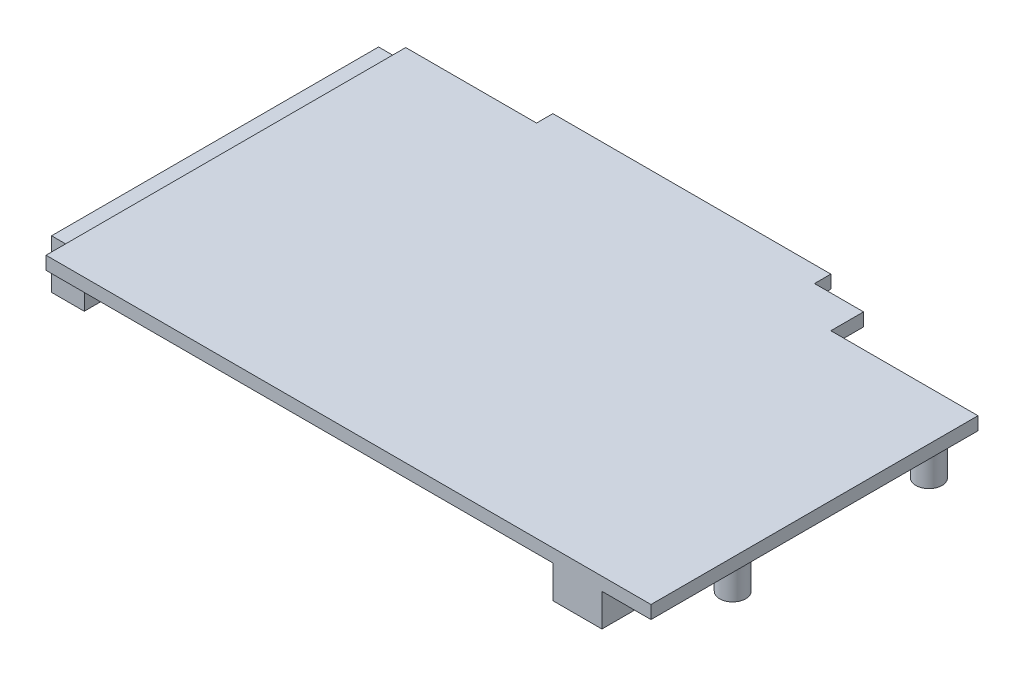
ISO-10303-21;
HEADER;
FILE_DESCRIPTION(('STEP AP214'),'2;1');
FILE_NAME('part.step','',(''),(''),'','','');
FILE_SCHEMA(('AUTOMOTIVE_DESIGN { 1 0 10303 214 1 1 1 1 }'));
ENDSEC;
DATA;
#1=APPLICATION_CONTEXT('core data for automotive mechanical design processes');
#2=APPLICATION_PROTOCOL_DEFINITION('international standard','automotive_design',2000,#1);
#3=PRODUCT_CONTEXT('',#1,'mechanical');
#4=PRODUCT('Part','Part','',(#3));
#5=PRODUCT_RELATED_PRODUCT_CATEGORY('part','',(#4));
#6=PRODUCT_DEFINITION_FORMATION('','',#4);
#7=PRODUCT_DEFINITION_CONTEXT('part definition',#1,'design');
#8=PRODUCT_DEFINITION('design','',#6,#7);
#9=PRODUCT_DEFINITION_SHAPE('','',#8);
#10=(LENGTH_UNIT() NAMED_UNIT(*) SI_UNIT(.MILLI.,.METRE.));
#11=(NAMED_UNIT(*) PLANE_ANGLE_UNIT() SI_UNIT($,.RADIAN.));
#12=(NAMED_UNIT(*) SI_UNIT($,.STERADIAN.) SOLID_ANGLE_UNIT());
#13=UNCERTAINTY_MEASURE_WITH_UNIT(LENGTH_MEASURE(1.E-05),#10,'distance_accuracy_value','');
#14=(GEOMETRIC_REPRESENTATION_CONTEXT(3) GLOBAL_UNCERTAINTY_ASSIGNED_CONTEXT((#13)) GLOBAL_UNIT_ASSIGNED_CONTEXT((#10,
#11,#12)) REPRESENTATION_CONTEXT('',''));
#15=CARTESIAN_POINT('',(0.,0.,0.));
#16=DIRECTION('',(0.,0.,1.));
#17=DIRECTION('',(1.,0.,0.));
#18=AXIS2_PLACEMENT_3D('',#15,#16,#17);
#19=CARTESIAN_POINT('',(0.,0.,-100.));
#20=DIRECTION('',(0.,-1.,0.));
#21=DIRECTION('',(0.,0.,-1.));
#22=AXIS2_PLACEMENT_3D('',#19,#20,#21);
#23=PLANE('',#22);
#24=CARTESIAN_POINT('',(180.,0.,-30.));
#25=DIRECTION('',(0.,-1.,0.));
#26=DIRECTION('',(0.,0.,-1.));
#27=AXIS2_PLACEMENT_3D('',#24,#25,#26);
#28=CIRCLE('',#27,3.99999999999999);
#29=CARTESIAN_POINT('',(180.,0.,-34.));
#30=VERTEX_POINT('',#29);
#31=EDGE_CURVE('E432',#30,#30,#28,.T.);
#32=ORIENTED_EDGE('',*,*,#31,.F.);
#33=EDGE_LOOP('',(#32));
#34=FACE_BOUND('',#33,.T.);
#35=DIRECTION('',(1.,0.,0.));
#36=VECTOR('',#35,1.);
#37=CARTESIAN_POINT('',(127.629312938026,0.,-90.));
#38=LINE('',#37,#36);
#39=CARTESIAN_POINT('',(127.629312938026,0.,-90.));
#40=VERTEX_POINT('',#39);
#41=CARTESIAN_POINT('',(147.629312938026,0.,-90.));
#42=VERTEX_POINT('',#41);
#43=EDGE_CURVE('E211',#40,#42,#38,.T.);
#44=ORIENTED_EDGE('',*,*,#43,.F.);
#45=DIRECTION('',(0.,0.,-1.));
#46=VECTOR('',#45,1.);
#47=CARTESIAN_POINT('',(127.629312938026,0.,-20.));
#48=LINE('',#47,#46);
#49=CARTESIAN_POINT('',(127.629312938026,0.,-20.));
#50=VERTEX_POINT('',#49);
#51=EDGE_CURVE('E208',#50,#40,#48,.T.);
#52=ORIENTED_EDGE('',*,*,#51,.F.);
#53=DIRECTION('',(-1.,0.,0.));
#54=VECTOR('',#53,1.);
#55=CARTESIAN_POINT('',(127.629312938026,0.,-20.));
#56=LINE('',#55,#54);
#57=CARTESIAN_POINT('',(147.629312938026,0.,-20.));
#58=VERTEX_POINT('',#57);
#59=EDGE_CURVE('E221',#58,#50,#56,.T.);
#60=ORIENTED_EDGE('',*,*,#59,.F.);
#61=DIRECTION('',(0.,0.,1.));
#62=VECTOR('',#61,1.);
#63=CARTESIAN_POINT('',(147.629312938026,0.,-20.));
#64=LINE('',#63,#62);
#65=EDGE_CURVE('E229',#42,#58,#64,.T.);
#66=ORIENTED_EDGE('',*,*,#65,.F.);
#67=EDGE_LOOP('',(#44,#52,#60,#66));
#68=FACE_BOUND('',#67,.T.);
#69=DIRECTION('',(1.,0.,0.));
#70=VECTOR('',#69,1.);
#71=CARTESIAN_POINT('',(0.,0.,0.));
#72=LINE('',#71,#70);
#73=CARTESIAN_POINT('',(170.,0.,0.));
#74=VERTEX_POINT('',#73);
#75=CARTESIAN_POINT('',(185.,0.,0.));
#76=VERTEX_POINT('',#75);
#77=EDGE_CURVE('E299',#74,#76,#72,.T.);
#78=ORIENTED_EDGE('',*,*,#77,.F.);
#79=DIRECTION('',(0.,0.,1.));
#80=VECTOR('',#79,1.);
#81=CARTESIAN_POINT('',(170.,0.,0.));
#82=LINE('',#81,#80);
#83=CARTESIAN_POINT('',(170.,0.,-20.));
#84=VERTEX_POINT('',#83);
#85=EDGE_CURVE('E49',#84,#74,#82,.T.);
#86=ORIENTED_EDGE('',*,*,#85,.F.);
#87=DIRECTION('',(1.,0.,0.));
#88=VECTOR('',#87,1.);
#89=CARTESIAN_POINT('',(170.,0.,-20.));
#90=LINE('',#89,#88);
#91=CARTESIAN_POINT('',(155.,0.,-20.));
#92=VERTEX_POINT('',#91);
#93=EDGE_CURVE('E205',#92,#84,#90,.T.);
#94=ORIENTED_EDGE('',*,*,#93,.F.);
#95=DIRECTION('',(0.,0.,-1.));
#96=VECTOR('',#95,1.);
#97=CARTESIAN_POINT('',(155.,0.,0.));
#98=LINE('',#97,#96);
#99=CARTESIAN_POINT('',(155.,0.,0.));
#100=VERTEX_POINT('',#99);
#101=EDGE_CURVE('E427',#100,#92,#98,.T.);
#102=ORIENTED_EDGE('',*,*,#101,.F.);
#103=CARTESIAN_POINT('',(0.,0.,0.));
#104=VERTEX_POINT('',#103);
#105=EDGE_CURVE('E307',#104,#100,#72,.T.);
#106=ORIENTED_EDGE('',*,*,#105,.F.);
#107=DIRECTION('',(0.,0.,1.));
#108=VECTOR('',#107,1.);
#109=CARTESIAN_POINT('',(0.,0.,0.));
#110=LINE('',#109,#108);
#111=CARTESIAN_POINT('',(0.,0.,-10.));
#112=VERTEX_POINT('',#111);
#113=EDGE_CURVE('E300',#112,#104,#110,.T.);
#114=ORIENTED_EDGE('',*,*,#113,.F.);
#115=DIRECTION('',(-1.,0.,0.));
#116=VECTOR('',#115,1.);
#117=CARTESIAN_POINT('',(1.69927822453019,0.,-10.));
#118=LINE('',#117,#116);
#119=CARTESIAN_POINT('',(1.69927822453019,0.,-10.));
#120=VERTEX_POINT('',#119);
#121=EDGE_CURVE('E252',#120,#112,#118,.T.);
#122=ORIENTED_EDGE('',*,*,#121,.F.);
#123=DIRECTION('',(0.,0.,1.));
#124=VECTOR('',#123,1.);
#125=CARTESIAN_POINT('',(1.69927822453019,0.,-110.));
#126=LINE('',#125,#124);
#127=CARTESIAN_POINT('',(1.69927822453018,0.,-110.));
#128=VERTEX_POINT('',#127);
#129=EDGE_CURVE('E240',#128,#120,#126,.T.);
#130=ORIENTED_EDGE('',*,*,#129,.F.);
#131=DIRECTION('',(1.,0.,0.));
#132=VECTOR('',#131,1.);
#133=CARTESIAN_POINT('',(-81.1570413077142,0.,-110.));
#134=LINE('',#133,#132);
#135=CARTESIAN_POINT('',(40.,0.,-110.));
#136=VERTEX_POINT('',#135);
#137=EDGE_CURVE('E278',#128,#136,#134,.T.);
#138=ORIENTED_EDGE('',*,*,#137,.T.);
#139=DIRECTION('',(0.,0.,-1.));
#140=VECTOR('',#139,1.);
#141=CARTESIAN_POINT('',(40.,0.,-53.5029668986773));
#142=LINE('',#141,#140);
#143=CARTESIAN_POINT('',(40.,0.,-115.));
#144=VERTEX_POINT('',#143);
#145=EDGE_CURVE('E276',#136,#144,#142,.T.);
#146=ORIENTED_EDGE('',*,*,#145,.T.);
#147=DIRECTION('',(1.,0.,0.));
#148=VECTOR('',#147,1.);
#149=CARTESIAN_POINT('',(-81.1570413077142,0.,-115.));
#150=LINE('',#149,#148);
#151=CARTESIAN_POINT('',(125.,0.,-115.));
#152=VERTEX_POINT('',#151);
#153=EDGE_CURVE('E274',#144,#152,#150,.T.);
#154=ORIENTED_EDGE('',*,*,#153,.T.);
#155=DIRECTION('',(0.,0.,-1.));
#156=VECTOR('',#155,1.);
#157=CARTESIAN_POINT('',(125.,0.,-53.5029668986773));
#158=LINE('',#157,#156);
#159=CARTESIAN_POINT('',(125.,0.,-110.));
#160=VERTEX_POINT('',#159);
#161=EDGE_CURVE('E270',#160,#152,#158,.T.);
#162=ORIENTED_EDGE('',*,*,#161,.F.);
#163=DIRECTION('',(-1.,0.,0.));
#164=VECTOR('',#163,1.);
#165=CARTESIAN_POINT('',(-81.1570413077142,0.,-110.));
#166=LINE('',#165,#164);
#167=CARTESIAN_POINT('',(140.,0.,-110.));
#168=VERTEX_POINT('',#167);
#169=EDGE_CURVE('E267',#168,#160,#166,.T.);
#170=ORIENTED_EDGE('',*,*,#169,.F.);
#171=DIRECTION('',(0.,0.,-1.));
#172=VECTOR('',#171,1.);
#173=CARTESIAN_POINT('',(140.,0.,-53.5029668986773));
#174=LINE('',#173,#172);
#175=CARTESIAN_POINT('',(140.,0.,-100.));
#176=VERTEX_POINT('',#175);
#177=EDGE_CURVE('E271',#176,#168,#174,.T.);
#178=ORIENTED_EDGE('',*,*,#177,.F.);
#179=DIRECTION('',(-1.,0.,0.));
#180=VECTOR('',#179,1.);
#181=CARTESIAN_POINT('',(0.,0.,-100.));
#182=LINE('',#181,#180);
#183=CARTESIAN_POINT('',(185.,0.,-100.));
#184=VERTEX_POINT('',#183);
#185=EDGE_CURVE('E311',#184,#176,#182,.T.);
#186=ORIENTED_EDGE('',*,*,#185,.F.);
#187=DIRECTION('',(0.,0.,-1.));
#188=VECTOR('',#187,1.);
#189=CARTESIAN_POINT('',(185.,0.,0.));
#190=LINE('',#189,#188);
#191=EDGE_CURVE('E309',#76,#184,#190,.T.);
#192=ORIENTED_EDGE('',*,*,#191,.F.);
#193=EDGE_LOOP('',(#78,#86,#94,#102,#106,#114,#122,#130,#138,#146,#154,#162,#170,#178,#186,#192));
#194=FACE_BOUND('',#193,.T.);
#195=CARTESIAN_POINT('',(180.,0.,-90.));
#196=DIRECTION('',(0.,-1.,0.));
#197=DIRECTION('',(0.,0.,-1.));
#198=AXIS2_PLACEMENT_3D('',#195,#196,#197);
#199=CIRCLE('',#198,3.99999999999999);
#200=CARTESIAN_POINT('',(180.,0.,-94.));
#201=VERTEX_POINT('',#200);
#202=EDGE_CURVE('E449',#201,#201,#199,.T.);
#203=ORIENTED_EDGE('',*,*,#202,.F.);
#204=EDGE_LOOP('',(#203));
#205=FACE_BOUND('',#204,.T.);
#206=ADVANCED_FACE('F32',(#34,#68,#194,#205),#23,.T.);
#207=CARTESIAN_POINT('',(0.,4.,0.));
#208=DIRECTION('',(1.,0.,0.));
#209=DIRECTION('',(0.,0.,-1.));
#210=AXIS2_PLACEMENT_3D('',#207,#208,#209);
#211=PLANE('',#210);
#212=CARTESIAN_POINT('',(0.,0.,-110.));
#213=VERTEX_POINT('',#212);
#214=EDGE_CURVE('E297',#213,#112,#110,.T.);
#215=ORIENTED_EDGE('',*,*,#214,.T.);
#216=ORIENTED_EDGE('',*,*,#113,.T.);
#217=DIRECTION('',(0.,-1.,0.));
#218=VECTOR('',#217,1.);
#219=CARTESIAN_POINT('',(0.,4.,0.));
#220=LINE('',#219,#218);
#221=CARTESIAN_POINT('',(0.,4.,0.));
#222=VERTEX_POINT('',#221);
#223=EDGE_CURVE('E11',#222,#104,#220,.T.);
#224=ORIENTED_EDGE('',*,*,#223,.F.);
#225=DIRECTION('',(0.,0.,1.));
#226=VECTOR('',#225,1.);
#227=CARTESIAN_POINT('',(0.,4.,0.));
#228=LINE('',#227,#226);
#229=CARTESIAN_POINT('',(0.,4.,-110.));
#230=VERTEX_POINT('',#229);
#231=EDGE_CURVE('E319',#230,#222,#228,.T.);
#232=ORIENTED_EDGE('',*,*,#231,.F.);
#233=DIRECTION('',(0.,1.,0.));
#234=VECTOR('',#233,1.);
#235=CARTESIAN_POINT('',(0.,0.,-110.));
#236=LINE('',#235,#234);
#237=EDGE_CURVE('E301',#213,#230,#236,.T.);
#238=ORIENTED_EDGE('',*,*,#237,.F.);
#239=EDGE_LOOP('',(#215,#216,#224,#232,#238));
#240=FACE_BOUND('',#239,.T.);
#241=ADVANCED_FACE('F34',(#240),#211,.F.);
#242=CARTESIAN_POINT('',(0.,4.,0.));
#243=DIRECTION('',(0.,0.,-1.));
#244=DIRECTION('',(-1.,0.,0.));
#245=AXIS2_PLACEMENT_3D('',#242,#243,#244);
#246=PLANE('',#245);
#247=ORIENTED_EDGE('',*,*,#105,.T.);
#248=DIRECTION('',(0.,1.,0.));
#249=VECTOR('',#248,1.);
#250=CARTESIAN_POINT('',(155.,-10.,0.));
#251=LINE('',#250,#249);
#252=CARTESIAN_POINT('',(155.,-10.,0.));
#253=VERTEX_POINT('',#252);
#254=EDGE_CURVE('E194',#253,#100,#251,.T.);
#255=ORIENTED_EDGE('',*,*,#254,.F.);
#256=DIRECTION('',(-1.,0.,0.));
#257=VECTOR('',#256,1.);
#258=CARTESIAN_POINT('',(170.,-10.,0.));
#259=LINE('',#258,#257);
#260=CARTESIAN_POINT('',(170.,-10.,0.));
#261=VERTEX_POINT('',#260);
#262=EDGE_CURVE('E188',#261,#253,#259,.T.);
#263=ORIENTED_EDGE('',*,*,#262,.F.);
#264=DIRECTION('',(0.,1.,0.));
#265=VECTOR('',#264,1.);
#266=CARTESIAN_POINT('',(170.,-10.,0.));
#267=LINE('',#266,#265);
#268=EDGE_CURVE('E192',#261,#74,#267,.T.);
#269=ORIENTED_EDGE('',*,*,#268,.T.);
#270=ORIENTED_EDGE('',*,*,#77,.T.);
#271=DIRECTION('',(0.,-1.,0.));
#272=VECTOR('',#271,1.);
#273=CARTESIAN_POINT('',(185.,4.,0.));
#274=LINE('',#273,#272);
#275=CARTESIAN_POINT('',(185.,4.,0.));
#276=VERTEX_POINT('',#275);
#277=EDGE_CURVE('E41',#276,#76,#274,.T.);
#278=ORIENTED_EDGE('',*,*,#277,.F.);
#279=DIRECTION('',(1.,0.,0.));
#280=VECTOR('',#279,1.);
#281=CARTESIAN_POINT('',(0.,4.,0.));
#282=LINE('',#281,#280);
#283=EDGE_CURVE('E338',#222,#276,#282,.T.);
#284=ORIENTED_EDGE('',*,*,#283,.F.);
#285=ORIENTED_EDGE('',*,*,#223,.T.);
#286=EDGE_LOOP('',(#247,#255,#263,#269,#270,#278,#284,#285));
#287=FACE_BOUND('',#286,.T.);
#288=ADVANCED_FACE('F191',(#287),#246,.F.);
#289=CARTESIAN_POINT('',(185.,4.,0.));
#290=DIRECTION('',(-1.,0.,0.));
#291=DIRECTION('',(0.,0.,1.));
#292=AXIS2_PLACEMENT_3D('',#289,#290,#291);
#293=PLANE('',#292);
#294=ORIENTED_EDGE('',*,*,#191,.T.);
#295=DIRECTION('',(0.,-1.,0.));
#296=VECTOR('',#295,1.);
#297=CARTESIAN_POINT('',(185.,4.,-100.));
#298=LINE('',#297,#296);
#299=CARTESIAN_POINT('',(185.,4.,-100.));
#300=VERTEX_POINT('',#299);
#301=EDGE_CURVE('E314',#300,#184,#298,.T.);
#302=ORIENTED_EDGE('',*,*,#301,.F.);
#303=DIRECTION('',(0.,0.,-1.));
#304=VECTOR('',#303,1.);
#305=CARTESIAN_POINT('',(185.,4.,0.));
#306=LINE('',#305,#304);
#307=EDGE_CURVE('E323',#276,#300,#306,.T.);
#308=ORIENTED_EDGE('',*,*,#307,.F.);
#309=ORIENTED_EDGE('',*,*,#277,.T.);
#310=EDGE_LOOP('',(#294,#302,#308,#309));
#311=FACE_BOUND('',#310,.T.);
#312=ADVANCED_FACE('F348',(#311),#293,.F.);
#313=CARTESIAN_POINT('',(0.,4.,-100.));
#314=DIRECTION('',(0.,0.,1.));
#315=DIRECTION('',(1.,0.,0.));
#316=AXIS2_PLACEMENT_3D('',#313,#314,#315);
#317=PLANE('',#316);
#318=ORIENTED_EDGE('',*,*,#185,.T.);
#319=DIRECTION('',(0.,1.,0.));
#320=VECTOR('',#319,1.);
#321=CARTESIAN_POINT('',(140.,0.,-100.));
#322=LINE('',#321,#320);
#323=CARTESIAN_POINT('',(140.,4.,-100.));
#324=VERTEX_POINT('',#323);
#325=EDGE_CURVE('E286',#176,#324,#322,.T.);
#326=ORIENTED_EDGE('',*,*,#325,.T.);
#327=DIRECTION('',(-1.,0.,0.));
#328=VECTOR('',#327,1.);
#329=CARTESIAN_POINT('',(0.,4.,-100.));
#330=LINE('',#329,#328);
#331=EDGE_CURVE('E320',#300,#324,#330,.T.);
#332=ORIENTED_EDGE('',*,*,#331,.F.);
#333=ORIENTED_EDGE('',*,*,#301,.T.);
#334=EDGE_LOOP('',(#318,#326,#332,#333));
#335=FACE_BOUND('',#334,.T.);
#336=ADVANCED_FACE('F352',(#335),#317,.F.);
#337=CARTESIAN_POINT('',(0.,4.,-100.));
#338=DIRECTION('',(0.,-1.,0.));
#339=DIRECTION('',(0.,0.,-1.));
#340=AXIS2_PLACEMENT_3D('',#337,#338,#339);
#341=PLANE('',#340);
#342=ORIENTED_EDGE('',*,*,#231,.T.);
#343=ORIENTED_EDGE('',*,*,#283,.T.);
#344=ORIENTED_EDGE('',*,*,#307,.T.);
#345=ORIENTED_EDGE('',*,*,#331,.T.);
#346=DIRECTION('',(0.,0.,-1.));
#347=VECTOR('',#346,1.);
#348=CARTESIAN_POINT('',(140.,4.,-53.5029668986773));
#349=LINE('',#348,#347);
#350=CARTESIAN_POINT('',(140.,4.,-110.));
#351=VERTEX_POINT('',#350);
#352=EDGE_CURVE('E324',#324,#351,#349,.T.);
#353=ORIENTED_EDGE('',*,*,#352,.T.);
#354=DIRECTION('',(-1.,0.,0.));
#355=VECTOR('',#354,1.);
#356=CARTESIAN_POINT('',(-81.1570413077142,4.,-110.));
#357=LINE('',#356,#355);
#358=CARTESIAN_POINT('',(125.,4.,-110.));
#359=VERTEX_POINT('',#358);
#360=EDGE_CURVE('E281',#351,#359,#357,.T.);
#361=ORIENTED_EDGE('',*,*,#360,.T.);
#362=DIRECTION('',(0.,0.,-1.));
#363=VECTOR('',#362,1.);
#364=CARTESIAN_POINT('',(125.,4.,-53.5029668986773));
#365=LINE('',#364,#363);
#366=CARTESIAN_POINT('',(125.,4.,-115.));
#367=VERTEX_POINT('',#366);
#368=EDGE_CURVE('E386',#359,#367,#365,.T.);
#369=ORIENTED_EDGE('',*,*,#368,.T.);
#370=DIRECTION('',(1.,0.,0.));
#371=VECTOR('',#370,1.);
#372=CARTESIAN_POINT('',(-81.1570413077142,4.,-115.));
#373=LINE('',#372,#371);
#374=CARTESIAN_POINT('',(40.,4.,-115.));
#375=VERTEX_POINT('',#374);
#376=EDGE_CURVE('E369',#375,#367,#373,.T.);
#377=ORIENTED_EDGE('',*,*,#376,.F.);
#378=DIRECTION('',(0.,0.,-1.));
#379=VECTOR('',#378,1.);
#380=CARTESIAN_POINT('',(40.,4.,-53.5029668986773));
#381=LINE('',#380,#379);
#382=CARTESIAN_POINT('',(40.,4.,-110.));
#383=VERTEX_POINT('',#382);
#384=EDGE_CURVE('E362',#383,#375,#381,.T.);
#385=ORIENTED_EDGE('',*,*,#384,.F.);
#386=DIRECTION('',(1.,0.,0.));
#387=VECTOR('',#386,1.);
#388=CARTESIAN_POINT('',(-81.1570413077142,4.,-110.));
#389=LINE('',#388,#387);
#390=EDGE_CURVE('E361',#230,#383,#389,.T.);
#391=ORIENTED_EDGE('',*,*,#390,.F.);
#392=EDGE_LOOP('',(#342,#343,#344,#345,#353,#361,#369,#377,#385,#391));
#393=FACE_BOUND('',#392,.T.);
#394=ADVANCED_FACE('F342',(#393),#341,.F.);
#395=CARTESIAN_POINT('',(-81.1570413077142,0.,-110.));
#396=DIRECTION('',(0.,0.,1.));
#397=DIRECTION('',(1.,0.,0.));
#398=AXIS2_PLACEMENT_3D('',#395,#396,#397);
#399=PLANE('',#398);
#400=ORIENTED_EDGE('',*,*,#390,.T.);
#401=DIRECTION('',(0.,1.,0.));
#402=VECTOR('',#401,1.);
#403=CARTESIAN_POINT('',(40.,0.,-110.));
#404=LINE('',#403,#402);
#405=EDGE_CURVE('E373',#136,#383,#404,.T.);
#406=ORIENTED_EDGE('',*,*,#405,.F.);
#407=ORIENTED_EDGE('',*,*,#137,.F.);
#408=DIRECTION('',(0.,1.,0.));
#409=VECTOR('',#408,1.);
#410=CARTESIAN_POINT('',(1.69927822453019,-15.,-110.));
#411=LINE('',#410,#409);
#412=CARTESIAN_POINT('',(1.69927822453019,-15.,-110.));
#413=VERTEX_POINT('',#412);
#414=EDGE_CURVE('E251',#413,#128,#411,.T.);
#415=ORIENTED_EDGE('',*,*,#414,.F.);
#416=DIRECTION('',(1.,0.,0.));
#417=VECTOR('',#416,1.);
#418=CARTESIAN_POINT('',(1.69927822453019,-15.,-110.));
#419=LINE('',#418,#417);
#420=CARTESIAN_POINT('',(-8.30072177546981,-15.,-110.));
#421=VERTEX_POINT('',#420);
#422=EDGE_CURVE('E249',#421,#413,#419,.T.);
#423=ORIENTED_EDGE('',*,*,#422,.F.);
#424=DIRECTION('',(0.,1.,0.));
#425=VECTOR('',#424,1.);
#426=CARTESIAN_POINT('',(-8.30072177546981,-15.,-110.));
#427=LINE('',#426,#425);
#428=CARTESIAN_POINT('',(-8.30072177546981,0.,-110.));
#429=VERTEX_POINT('',#428);
#430=EDGE_CURVE('E260',#421,#429,#427,.T.);
#431=ORIENTED_EDGE('',*,*,#430,.T.);
#432=DIRECTION('',(1.,0.,0.));
#433=VECTOR('',#432,1.);
#434=CARTESIAN_POINT('',(1.69927822453019,0.,-110.));
#435=LINE('',#434,#433);
#436=EDGE_CURVE('E245',#429,#213,#435,.T.);
#437=ORIENTED_EDGE('',*,*,#436,.T.);
#438=ORIENTED_EDGE('',*,*,#237,.T.);
#439=EDGE_LOOP('',(#400,#406,#407,#415,#423,#431,#437,#438));
#440=FACE_BOUND('',#439,.T.);
#441=ADVANCED_FACE('F399',(#440),#399,.F.);
#442=CARTESIAN_POINT('',(40.,0.,-53.5029668986773));
#443=DIRECTION('',(1.,0.,0.));
#444=DIRECTION('',(0.,0.,-1.));
#445=AXIS2_PLACEMENT_3D('',#442,#443,#444);
#446=PLANE('',#445);
#447=ORIENTED_EDGE('',*,*,#384,.T.);
#448=DIRECTION('',(0.,1.,0.));
#449=VECTOR('',#448,1.);
#450=CARTESIAN_POINT('',(40.,0.,-115.));
#451=LINE('',#450,#449);
#452=EDGE_CURVE('E375',#144,#375,#451,.T.);
#453=ORIENTED_EDGE('',*,*,#452,.F.);
#454=ORIENTED_EDGE('',*,*,#145,.F.);
#455=ORIENTED_EDGE('',*,*,#405,.T.);
#456=EDGE_LOOP('',(#447,#453,#454,#455));
#457=FACE_BOUND('',#456,.T.);
#458=ADVANCED_FACE('F396',(#457),#446,.F.);
#459=CARTESIAN_POINT('',(-81.1570413077142,0.,-115.));
#460=DIRECTION('',(0.,0.,1.));
#461=DIRECTION('',(1.,0.,0.));
#462=AXIS2_PLACEMENT_3D('',#459,#460,#461);
#463=PLANE('',#462);
#464=ORIENTED_EDGE('',*,*,#376,.T.);
#465=DIRECTION('',(0.,1.,0.));
#466=VECTOR('',#465,1.);
#467=CARTESIAN_POINT('',(125.,0.,-115.));
#468=LINE('',#467,#466);
#469=EDGE_CURVE('E378',#152,#367,#468,.T.);
#470=ORIENTED_EDGE('',*,*,#469,.F.);
#471=ORIENTED_EDGE('',*,*,#153,.F.);
#472=ORIENTED_EDGE('',*,*,#452,.T.);
#473=EDGE_LOOP('',(#464,#470,#471,#472));
#474=FACE_BOUND('',#473,.T.);
#475=ADVANCED_FACE('F391',(#474),#463,.F.);
#476=CARTESIAN_POINT('',(125.,0.,-53.5029668986773));
#477=DIRECTION('',(1.,0.,0.));
#478=DIRECTION('',(0.,0.,-1.));
#479=AXIS2_PLACEMENT_3D('',#476,#477,#478);
#480=PLANE('',#479);
#481=ORIENTED_EDGE('',*,*,#368,.F.);
#482=DIRECTION('',(0.,1.,0.));
#483=VECTOR('',#482,1.);
#484=CARTESIAN_POINT('',(125.,0.,-110.));
#485=LINE('',#484,#483);
#486=EDGE_CURVE('E379',#160,#359,#485,.T.);
#487=ORIENTED_EDGE('',*,*,#486,.F.);
#488=ORIENTED_EDGE('',*,*,#161,.T.);
#489=ORIENTED_EDGE('',*,*,#469,.T.);
#490=EDGE_LOOP('',(#481,#487,#488,#489));
#491=FACE_BOUND('',#490,.T.);
#492=ADVANCED_FACE('F516',(#491),#480,.T.);
#493=CARTESIAN_POINT('',(-81.1570413077142,0.,-110.));
#494=DIRECTION('',(0.,0.,-1.));
#495=DIRECTION('',(-1.,0.,0.));
#496=AXIS2_PLACEMENT_3D('',#493,#494,#495);
#497=PLANE('',#496);
#498=ORIENTED_EDGE('',*,*,#360,.F.);
#499=DIRECTION('',(0.,1.,0.));
#500=VECTOR('',#499,1.);
#501=CARTESIAN_POINT('',(140.,0.,-110.));
#502=LINE('',#501,#500);
#503=EDGE_CURVE('E331',#168,#351,#502,.T.);
#504=ORIENTED_EDGE('',*,*,#503,.F.);
#505=ORIENTED_EDGE('',*,*,#169,.T.);
#506=ORIENTED_EDGE('',*,*,#486,.T.);
#507=EDGE_LOOP('',(#498,#504,#505,#506));
#508=FACE_BOUND('',#507,.T.);
#509=ADVANCED_FACE('F384',(#508),#497,.T.);
#510=CARTESIAN_POINT('',(140.,0.,-53.5029668986773));
#511=DIRECTION('',(1.,0.,0.));
#512=DIRECTION('',(0.,0.,-1.));
#513=AXIS2_PLACEMENT_3D('',#510,#511,#512);
#514=PLANE('',#513);
#515=ORIENTED_EDGE('',*,*,#352,.F.);
#516=ORIENTED_EDGE('',*,*,#325,.F.);
#517=ORIENTED_EDGE('',*,*,#177,.T.);
#518=ORIENTED_EDGE('',*,*,#503,.T.);
#519=EDGE_LOOP('',(#515,#516,#517,#518));
#520=FACE_BOUND('',#519,.T.);
#521=ADVANCED_FACE('F356',(#520),#514,.T.);
#522=CARTESIAN_POINT('',(1.69927822453019,-15.,-110.));
#523=DIRECTION('',(-1.,0.,0.));
#524=DIRECTION('',(0.,0.,1.));
#525=AXIS2_PLACEMENT_3D('',#522,#523,#524);
#526=PLANE('',#525);
#527=ORIENTED_EDGE('',*,*,#129,.T.);
#528=DIRECTION('',(0.,1.,0.));
#529=VECTOR('',#528,1.);
#530=CARTESIAN_POINT('',(1.69927822453019,-15.,-10.));
#531=LINE('',#530,#529);
#532=CARTESIAN_POINT('',(1.69927822453019,-15.,-10.));
#533=VERTEX_POINT('',#532);
#534=EDGE_CURVE('E266',#533,#120,#531,.T.);
#535=ORIENTED_EDGE('',*,*,#534,.F.);
#536=DIRECTION('',(0.,0.,1.));
#537=VECTOR('',#536,1.);
#538=CARTESIAN_POINT('',(1.69927822453019,-15.,-110.));
#539=LINE('',#538,#537);
#540=EDGE_CURVE('E241',#413,#533,#539,.T.);
#541=ORIENTED_EDGE('',*,*,#540,.F.);
#542=ORIENTED_EDGE('',*,*,#414,.T.);
#543=EDGE_LOOP('',(#527,#535,#541,#542));
#544=FACE_BOUND('',#543,.T.);
#545=ADVANCED_FACE('F404',(#544),#526,.F.);
#546=CARTESIAN_POINT('',(1.69927822453019,-15.,-10.));
#547=DIRECTION('',(0.,0.,-1.));
#548=DIRECTION('',(-1.,0.,0.));
#549=AXIS2_PLACEMENT_3D('',#546,#547,#548);
#550=PLANE('',#549);
#551=ORIENTED_EDGE('',*,*,#121,.T.);
#552=CARTESIAN_POINT('',(-8.30072177546981,0.,-10.));
#553=VERTEX_POINT('',#552);
#554=EDGE_CURVE('E256',#112,#553,#118,.T.);
#555=ORIENTED_EDGE('',*,*,#554,.T.);
#556=DIRECTION('',(0.,1.,0.));
#557=VECTOR('',#556,1.);
#558=CARTESIAN_POINT('',(-8.30072177546981,-15.,-10.));
#559=LINE('',#558,#557);
#560=CARTESIAN_POINT('',(-8.30072177546981,-15.,-10.));
#561=VERTEX_POINT('',#560);
#562=EDGE_CURVE('E415',#561,#553,#559,.T.);
#563=ORIENTED_EDGE('',*,*,#562,.F.);
#564=DIRECTION('',(-1.,0.,0.));
#565=VECTOR('',#564,1.);
#566=CARTESIAN_POINT('',(1.69927822453019,-15.,-10.));
#567=LINE('',#566,#565);
#568=EDGE_CURVE('E244',#533,#561,#567,.T.);
#569=ORIENTED_EDGE('',*,*,#568,.F.);
#570=ORIENTED_EDGE('',*,*,#534,.T.);
#571=EDGE_LOOP('',(#551,#555,#563,#569,#570));
#572=FACE_BOUND('',#571,.T.);
#573=ADVANCED_FACE('F540',(#572),#550,.F.);
#574=CARTESIAN_POINT('',(-8.30072177546981,-15.,-110.));
#575=DIRECTION('',(1.,0.,0.));
#576=DIRECTION('',(0.,0.,-1.));
#577=AXIS2_PLACEMENT_3D('',#574,#575,#576);
#578=PLANE('',#577);
#579=DIRECTION('',(0.,0.,-1.));
#580=VECTOR('',#579,1.);
#581=CARTESIAN_POINT('',(-8.30072177546981,0.,-110.));
#582=LINE('',#581,#580);
#583=EDGE_CURVE('E255',#553,#429,#582,.T.);
#584=ORIENTED_EDGE('',*,*,#583,.T.);
#585=ORIENTED_EDGE('',*,*,#430,.F.);
#586=DIRECTION('',(0.,0.,-1.));
#587=VECTOR('',#586,1.);
#588=CARTESIAN_POINT('',(-8.30072177546981,-15.,-110.));
#589=LINE('',#588,#587);
#590=EDGE_CURVE('E247',#561,#421,#589,.T.);
#591=ORIENTED_EDGE('',*,*,#590,.F.);
#592=ORIENTED_EDGE('',*,*,#562,.T.);
#593=EDGE_LOOP('',(#584,#585,#591,#592));
#594=FACE_BOUND('',#593,.T.);
#595=ADVANCED_FACE('F547',(#594),#578,.F.);
#596=CARTESIAN_POINT('',(1.69927822453019,-15.,-10.));
#597=DIRECTION('',(0.,-1.,0.));
#598=DIRECTION('',(0.,0.,-1.));
#599=AXIS2_PLACEMENT_3D('',#596,#597,#598);
#600=PLANE('',#599);
#601=ORIENTED_EDGE('',*,*,#540,.T.);
#602=ORIENTED_EDGE('',*,*,#568,.T.);
#603=ORIENTED_EDGE('',*,*,#590,.T.);
#604=ORIENTED_EDGE('',*,*,#422,.T.);
#605=EDGE_LOOP('',(#601,#602,#603,#604));
#606=FACE_BOUND('',#605,.T.);
#607=ADVANCED_FACE('F408',(#606),#600,.T.);
#608=CARTESIAN_POINT('',(1.69927822453019,0.,-10.));
#609=DIRECTION('',(0.,-1.,0.));
#610=DIRECTION('',(0.,0.,-1.));
#611=AXIS2_PLACEMENT_3D('',#608,#609,#610);
#612=PLANE('',#611);
#613=ORIENTED_EDGE('',*,*,#214,.F.);
#614=ORIENTED_EDGE('',*,*,#436,.F.);
#615=ORIENTED_EDGE('',*,*,#583,.F.);
#616=ORIENTED_EDGE('',*,*,#554,.F.);
#617=EDGE_LOOP('',(#613,#614,#615,#616));
#618=FACE_BOUND('',#617,.T.);
#619=ADVANCED_FACE('F419',(#618),#612,.F.);
#620=CARTESIAN_POINT('',(127.629312938026,-6.,-20.));
#621=DIRECTION('',(1.,0.,0.));
#622=DIRECTION('',(0.,0.,-1.));
#623=AXIS2_PLACEMENT_3D('',#620,#621,#622);
#624=PLANE('',#623);
#625=ORIENTED_EDGE('',*,*,#51,.T.);
#626=DIRECTION('',(0.,1.,0.));
#627=VECTOR('',#626,1.);
#628=CARTESIAN_POINT('',(127.629312938026,-6.,-90.));
#629=LINE('',#628,#627);
#630=CARTESIAN_POINT('',(127.629312938026,-6.,-90.));
#631=VERTEX_POINT('',#630);
#632=EDGE_CURVE('E238',#631,#40,#629,.T.);
#633=ORIENTED_EDGE('',*,*,#632,.F.);
#634=DIRECTION('',(0.,0.,-1.));
#635=VECTOR('',#634,1.);
#636=CARTESIAN_POINT('',(127.629312938026,-6.,-20.));
#637=LINE('',#636,#635);
#638=CARTESIAN_POINT('',(127.629312938026,-6.,-20.));
#639=VERTEX_POINT('',#638);
#640=EDGE_CURVE('E217',#639,#631,#637,.T.);
#641=ORIENTED_EDGE('',*,*,#640,.F.);
#642=DIRECTION('',(0.,1.,0.));
#643=VECTOR('',#642,1.);
#644=CARTESIAN_POINT('',(127.629312938026,-6.,-20.));
#645=LINE('',#644,#643);
#646=EDGE_CURVE('E226',#639,#50,#645,.T.);
#647=ORIENTED_EDGE('',*,*,#646,.T.);
#648=EDGE_LOOP('',(#625,#633,#641,#647));
#649=FACE_BOUND('',#648,.T.);
#650=ADVANCED_FACE('F567',(#649),#624,.F.);
#651=CARTESIAN_POINT('',(127.629312938026,-6.,-90.));
#652=DIRECTION('',(0.,0.,1.));
#653=DIRECTION('',(1.,0.,0.));
#654=AXIS2_PLACEMENT_3D('',#651,#652,#653);
#655=PLANE('',#654);
#656=ORIENTED_EDGE('',*,*,#43,.T.);
#657=DIRECTION('',(0.,1.,0.));
#658=VECTOR('',#657,1.);
#659=CARTESIAN_POINT('',(147.629312938026,-6.,-90.));
#660=LINE('',#659,#658);
#661=CARTESIAN_POINT('',(147.629312938026,-6.,-90.));
#662=VERTEX_POINT('',#661);
#663=EDGE_CURVE('E235',#662,#42,#660,.T.);
#664=ORIENTED_EDGE('',*,*,#663,.F.);
#665=DIRECTION('',(1.,0.,0.));
#666=VECTOR('',#665,1.);
#667=CARTESIAN_POINT('',(127.629312938026,-6.,-90.));
#668=LINE('',#667,#666);
#669=EDGE_CURVE('E220',#631,#662,#668,.T.);
#670=ORIENTED_EDGE('',*,*,#669,.F.);
#671=ORIENTED_EDGE('',*,*,#632,.T.);
#672=EDGE_LOOP('',(#656,#664,#670,#671));
#673=FACE_BOUND('',#672,.T.);
#674=ADVANCED_FACE('F574',(#673),#655,.F.);
#675=CARTESIAN_POINT('',(147.629312938026,-6.,-20.));
#676=DIRECTION('',(-1.,0.,0.));
#677=DIRECTION('',(0.,0.,1.));
#678=AXIS2_PLACEMENT_3D('',#675,#676,#677);
#679=PLANE('',#678);
#680=ORIENTED_EDGE('',*,*,#65,.T.);
#681=DIRECTION('',(0.,1.,0.));
#682=VECTOR('',#681,1.);
#683=CARTESIAN_POINT('',(147.629312938026,-6.,-20.));
#684=LINE('',#683,#682);
#685=CARTESIAN_POINT('',(147.629312938026,-6.,-20.));
#686=VERTEX_POINT('',#685);
#687=EDGE_CURVE('E57',#686,#58,#684,.T.);
#688=ORIENTED_EDGE('',*,*,#687,.F.);
#689=DIRECTION('',(0.,0.,1.));
#690=VECTOR('',#689,1.);
#691=CARTESIAN_POINT('',(147.629312938026,-6.,-20.));
#692=LINE('',#691,#690);
#693=EDGE_CURVE('E223',#662,#686,#692,.T.);
#694=ORIENTED_EDGE('',*,*,#693,.F.);
#695=ORIENTED_EDGE('',*,*,#663,.T.);
#696=EDGE_LOOP('',(#680,#688,#694,#695));
#697=FACE_BOUND('',#696,.T.);
#698=ADVANCED_FACE('F582',(#697),#679,.F.);
#699=CARTESIAN_POINT('',(127.629312938026,-6.,-20.));
#700=DIRECTION('',(0.,0.,-1.));
#701=DIRECTION('',(-1.,0.,0.));
#702=AXIS2_PLACEMENT_3D('',#699,#700,#701);
#703=PLANE('',#702);
#704=ORIENTED_EDGE('',*,*,#59,.T.);
#705=ORIENTED_EDGE('',*,*,#646,.F.);
#706=DIRECTION('',(-1.,0.,0.));
#707=VECTOR('',#706,1.);
#708=CARTESIAN_POINT('',(127.629312938026,-6.,-20.));
#709=LINE('',#708,#707);
#710=EDGE_CURVE('E225',#686,#639,#709,.T.);
#711=ORIENTED_EDGE('',*,*,#710,.F.);
#712=ORIENTED_EDGE('',*,*,#687,.T.);
#713=EDGE_LOOP('',(#704,#705,#711,#712));
#714=FACE_BOUND('',#713,.T.);
#715=ADVANCED_FACE('F590',(#714),#703,.F.);
#716=CARTESIAN_POINT('',(127.629312938026,-6.,-90.));
#717=DIRECTION('',(0.,-1.,0.));
#718=DIRECTION('',(0.,0.,-1.));
#719=AXIS2_PLACEMENT_3D('',#716,#717,#718);
#720=PLANE('',#719);
#721=ORIENTED_EDGE('',*,*,#640,.T.);
#722=ORIENTED_EDGE('',*,*,#669,.T.);
#723=ORIENTED_EDGE('',*,*,#693,.T.);
#724=ORIENTED_EDGE('',*,*,#710,.T.);
#725=EDGE_LOOP('',(#721,#722,#723,#724));
#726=FACE_BOUND('',#725,.T.);
#727=ADVANCED_FACE('F598',(#726),#720,.T.);
#728=CARTESIAN_POINT('',(170.,-10.,0.));
#729=DIRECTION('',(-1.,0.,0.));
#730=DIRECTION('',(0.,0.,1.));
#731=AXIS2_PLACEMENT_3D('',#728,#729,#730);
#732=PLANE('',#731);
#733=ORIENTED_EDGE('',*,*,#85,.T.);
#734=ORIENTED_EDGE('',*,*,#268,.F.);
#735=DIRECTION('',(0.,0.,1.));
#736=VECTOR('',#735,1.);
#737=CARTESIAN_POINT('',(170.,-10.,0.));
#738=LINE('',#737,#736);
#739=CARTESIAN_POINT('',(170.,-10.,-20.));
#740=VERTEX_POINT('',#739);
#741=EDGE_CURVE('E198',#740,#261,#738,.T.);
#742=ORIENTED_EDGE('',*,*,#741,.F.);
#743=DIRECTION('',(0.,1.,0.));
#744=VECTOR('',#743,1.);
#745=CARTESIAN_POINT('',(170.,-10.,-20.));
#746=LINE('',#745,#744);
#747=EDGE_CURVE('E438',#740,#84,#746,.T.);
#748=ORIENTED_EDGE('',*,*,#747,.T.);
#749=EDGE_LOOP('',(#733,#734,#742,#748));
#750=FACE_BOUND('',#749,.T.);
#751=ADVANCED_FACE('F207',(#750),#732,.F.);
#752=CARTESIAN_POINT('',(155.,-10.,0.));
#753=DIRECTION('',(1.,0.,0.));
#754=DIRECTION('',(0.,0.,-1.));
#755=AXIS2_PLACEMENT_3D('',#752,#753,#754);
#756=PLANE('',#755);
#757=ORIENTED_EDGE('',*,*,#101,.T.);
#758=DIRECTION('',(0.,1.,0.));
#759=VECTOR('',#758,1.);
#760=CARTESIAN_POINT('',(155.,-10.,-20.));
#761=LINE('',#760,#759);
#762=CARTESIAN_POINT('',(155.,-10.,-20.));
#763=VERTEX_POINT('',#762);
#764=EDGE_CURVE('E213',#763,#92,#761,.T.);
#765=ORIENTED_EDGE('',*,*,#764,.F.);
#766=DIRECTION('',(0.,0.,-1.));
#767=VECTOR('',#766,1.);
#768=CARTESIAN_POINT('',(155.,-10.,0.));
#769=LINE('',#768,#767);
#770=EDGE_CURVE('E197',#253,#763,#769,.T.);
#771=ORIENTED_EDGE('',*,*,#770,.F.);
#772=ORIENTED_EDGE('',*,*,#254,.T.);
#773=EDGE_LOOP('',(#757,#765,#771,#772));
#774=FACE_BOUND('',#773,.T.);
#775=ADVANCED_FACE('F444',(#774),#756,.F.);
#776=CARTESIAN_POINT('',(170.,-10.,-20.));
#777=DIRECTION('',(0.,0.,1.));
#778=DIRECTION('',(1.,0.,0.));
#779=AXIS2_PLACEMENT_3D('',#776,#777,#778);
#780=PLANE('',#779);
#781=ORIENTED_EDGE('',*,*,#93,.T.);
#782=ORIENTED_EDGE('',*,*,#747,.F.);
#783=DIRECTION('',(1.,0.,0.));
#784=VECTOR('',#783,1.);
#785=CARTESIAN_POINT('',(170.,-10.,-20.));
#786=LINE('',#785,#784);
#787=EDGE_CURVE('E203',#763,#740,#786,.T.);
#788=ORIENTED_EDGE('',*,*,#787,.F.);
#789=ORIENTED_EDGE('',*,*,#764,.T.);
#790=EDGE_LOOP('',(#781,#782,#788,#789));
#791=FACE_BOUND('',#790,.T.);
#792=ADVANCED_FACE('F442',(#791),#780,.F.);
#793=CARTESIAN_POINT('',(170.,-10.,-20.));
#794=DIRECTION('',(0.,1.,0.));
#795=DIRECTION('',(0.,0.,1.));
#796=AXIS2_PLACEMENT_3D('',#793,#794,#795);
#797=PLANE('',#796);
#798=ORIENTED_EDGE('',*,*,#741,.T.);
#799=ORIENTED_EDGE('',*,*,#262,.T.);
#800=ORIENTED_EDGE('',*,*,#770,.T.);
#801=ORIENTED_EDGE('',*,*,#787,.T.);
#802=EDGE_LOOP('',(#798,#799,#800,#801));
#803=FACE_BOUND('',#802,.T.);
#804=ADVANCED_FACE('F201',(#803),#797,.F.);
#805=CARTESIAN_POINT('',(180.,-10.,-30.));
#806=DIRECTION('',(0.,1.,0.));
#807=DIRECTION('',(0.,0.,1.));
#808=AXIS2_PLACEMENT_3D('',#805,#806,#807);
#809=CYLINDRICAL_SURFACE('',#808,3.99999999999999);
#810=CARTESIAN_POINT('',(180.,-10.,-30.));
#811=DIRECTION('',(0.,-1.,0.));
#812=DIRECTION('',(0.,0.,-1.));
#813=AXIS2_PLACEMENT_3D('',#810,#811,#812);
#814=CIRCLE('',#813,3.99999999999999);
#815=CARTESIAN_POINT('',(180.,-10.,-34.));
#816=VERTEX_POINT('',#815);
#817=EDGE_CURVE('E428',#816,#816,#814,.T.);
#818=ORIENTED_EDGE('',*,*,#817,.F.);
#819=EDGE_LOOP('',(#818));
#820=FACE_BOUND('',#819,.T.);
#821=ORIENTED_EDGE('',*,*,#31,.T.);
#822=EDGE_LOOP('',(#821));
#823=FACE_BOUND('',#822,.T.);
#824=ADVANCED_FACE('F628',(#820,#823),#809,.T.);
#825=CARTESIAN_POINT('',(180.,-10.,-30.));
#826=DIRECTION('',(0.,-1.,0.));
#827=DIRECTION('',(0.,0.,-1.));
#828=AXIS2_PLACEMENT_3D('',#825,#826,#827);
#829=PLANE('',#828);
#830=ORIENTED_EDGE('',*,*,#817,.T.);
#831=EDGE_LOOP('',(#830));
#832=FACE_BOUND('',#831,.T.);
#833=ADVANCED_FACE('F460',(#832),#829,.T.);
#834=CARTESIAN_POINT('',(180.,-10.,-90.));
#835=DIRECTION('',(0.,1.,0.));
#836=DIRECTION('',(0.,0.,1.));
#837=AXIS2_PLACEMENT_3D('',#834,#835,#836);
#838=CYLINDRICAL_SURFACE('',#837,3.99999999999999);
#839=CARTESIAN_POINT('',(180.,-10.,-90.));
#840=DIRECTION('',(0.,-1.,0.));
#841=DIRECTION('',(0.,0.,-1.));
#842=AXIS2_PLACEMENT_3D('',#839,#840,#841);
#843=CIRCLE('',#842,3.99999999999999);
#844=CARTESIAN_POINT('',(180.,-10.,-94.));
#845=VERTEX_POINT('',#844);
#846=EDGE_CURVE('E447',#845,#845,#843,.T.);
#847=ORIENTED_EDGE('',*,*,#846,.F.);
#848=EDGE_LOOP('',(#847));
#849=FACE_BOUND('',#848,.T.);
#850=ORIENTED_EDGE('',*,*,#202,.T.);
#851=EDGE_LOOP('',(#850));
#852=FACE_BOUND('',#851,.T.);
#853=ADVANCED_FACE('F457',(#849,#852),#838,.T.);
#854=CARTESIAN_POINT('',(180.,-10.,-90.));
#855=DIRECTION('',(0.,-1.,0.));
#856=DIRECTION('',(0.,0.,-1.));
#857=AXIS2_PLACEMENT_3D('',#854,#855,#856);
#858=PLANE('',#857);
#859=ORIENTED_EDGE('',*,*,#846,.T.);
#860=EDGE_LOOP('',(#859));
#861=FACE_BOUND('',#860,.T.);
#862=ADVANCED_FACE('F455',(#861),#858,.T.);
#863=CLOSED_SHELL('',(#206,#241,#288,#312,#336,#394,#441,#458,#475,#492,#509,#521,#545,#573,
#595,#607,#619,#650,#674,#698,#715,#727,#751,#775,#792,#804,#824,#833,#853,#862));
#864=MANIFOLD_SOLID_BREP('B2',#863);
#865=ADVANCED_BREP_SHAPE_REPRESENTATION('',(#18,#864),#14);
#866=SHAPE_DEFINITION_REPRESENTATION(#9,#865);
ENDSEC;
END-ISO-10303-21;
